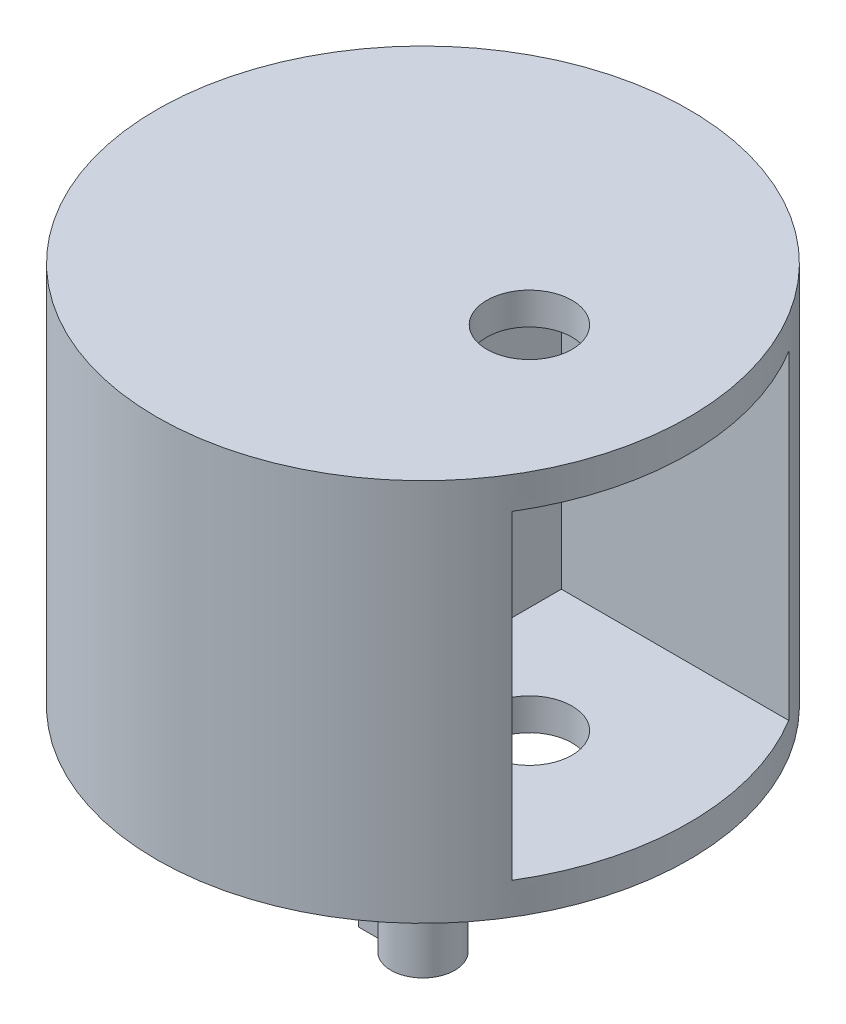
ISO-10303-21;
HEADER;
FILE_DESCRIPTION(('STEP AP214'),'2;1');
FILE_NAME('part.step','',(''),(''),'','','');
FILE_SCHEMA(('AUTOMOTIVE_DESIGN { 1 0 10303 214 1 1 1 1 }'));
ENDSEC;
DATA;
#1=APPLICATION_CONTEXT('core data for automotive mechanical design processes');
#2=APPLICATION_PROTOCOL_DEFINITION('international standard','automotive_design',2000,#1);
#3=PRODUCT_CONTEXT('',#1,'mechanical');
#4=PRODUCT('Part','Part','',(#3));
#5=PRODUCT_RELATED_PRODUCT_CATEGORY('part','',(#4));
#6=PRODUCT_DEFINITION_FORMATION('','',#4);
#7=PRODUCT_DEFINITION_CONTEXT('part definition',#1,'design');
#8=PRODUCT_DEFINITION('design','',#6,#7);
#9=PRODUCT_DEFINITION_SHAPE('','',#8);
#10=(LENGTH_UNIT() NAMED_UNIT(*) SI_UNIT(.MILLI.,.METRE.));
#11=(NAMED_UNIT(*) PLANE_ANGLE_UNIT() SI_UNIT($,.RADIAN.));
#12=(NAMED_UNIT(*) SI_UNIT($,.STERADIAN.) SOLID_ANGLE_UNIT());
#13=UNCERTAINTY_MEASURE_WITH_UNIT(LENGTH_MEASURE(1.E-05),#10,'distance_accuracy_value','');
#14=(GEOMETRIC_REPRESENTATION_CONTEXT(3) GLOBAL_UNCERTAINTY_ASSIGNED_CONTEXT((#13)) GLOBAL_UNIT_ASSIGNED_CONTEXT((#10,
#11,#12)) REPRESENTATION_CONTEXT('',''));
#15=CARTESIAN_POINT('',(0.,0.,0.));
#16=DIRECTION('',(0.,0.,1.));
#17=DIRECTION('',(1.,0.,0.));
#18=AXIS2_PLACEMENT_3D('',#15,#16,#17);
#19=CARTESIAN_POINT('',(0.,0.,0.));
#20=DIRECTION('',(0.,1.,0.));
#21=DIRECTION('',(0.,0.,1.));
#22=AXIS2_PLACEMENT_3D('',#19,#20,#21);
#23=PLANE('',#22);
#24=CARTESIAN_POINT('',(0.,0.,0.));
#25=DIRECTION('',(0.,1.,0.));
#26=DIRECTION('',(0.,0.,1.));
#27=AXIS2_PLACEMENT_3D('',#24,#25,#26);
#28=CIRCLE('',#27,12.5);
#29=CARTESIAN_POINT('',(0.,0.,12.5));
#30=VERTEX_POINT('',#29);
#31=EDGE_CURVE('E179',#30,#30,#28,.T.);
#32=ORIENTED_EDGE('',*,*,#31,.F.);
#33=EDGE_LOOP('',(#32));
#34=FACE_BOUND('',#33,.T.);
#35=CARTESIAN_POINT('',(5.,0.,0.));
#36=DIRECTION('',(0.,-1.,0.));
#37=DIRECTION('',(0.,0.,-1.));
#38=AXIS2_PLACEMENT_3D('',#35,#36,#37);
#39=CIRCLE('',#38,2.);
#40=CARTESIAN_POINT('',(5.,0.,-2.));
#41=VERTEX_POINT('',#40);
#42=EDGE_CURVE('E133',#41,#41,#39,.T.);
#43=ORIENTED_EDGE('',*,*,#42,.F.);
#44=EDGE_LOOP('',(#43));
#45=FACE_BOUND('',#44,.T.);
#46=CARTESIAN_POINT('',(0.,0.,0.));
#47=DIRECTION('',(0.,-1.,0.));
#48=DIRECTION('',(0.,0.,-1.));
#49=AXIS2_PLACEMENT_3D('',#46,#47,#48);
#50=CIRCLE('',#49,1.5);
#51=CARTESIAN_POINT('',(-1.4142135623731,0.,-0.5));
#52=VERTEX_POINT('',#51);
#53=CARTESIAN_POINT('',(-1.4142135623731,0.,0.5));
#54=VERTEX_POINT('',#53);
#55=EDGE_CURVE('E131',#52,#54,#50,.T.);
#56=ORIENTED_EDGE('',*,*,#55,.F.);
#57=DIRECTION('',(1.,0.,0.));
#58=VECTOR('',#57,1.);
#59=CARTESIAN_POINT('',(-1.4142135623731,0.,-0.5));
#60=LINE('',#59,#58);
#61=CARTESIAN_POINT('',(-2.5142135623731,0.,-0.5));
#62=VERTEX_POINT('',#61);
#63=EDGE_CURVE('E128',#62,#52,#60,.T.);
#64=ORIENTED_EDGE('',*,*,#63,.F.);
#65=DIRECTION('',(0.,0.,-1.));
#66=VECTOR('',#65,1.);
#67=CARTESIAN_POINT('',(-2.5142135623731,0.,0.5));
#68=LINE('',#67,#66);
#69=CARTESIAN_POINT('',(-2.5142135623731,0.,0.5));
#70=VERTEX_POINT('',#69);
#71=EDGE_CURVE('E65',#70,#62,#68,.T.);
#72=ORIENTED_EDGE('',*,*,#71,.F.);
#73=DIRECTION('',(-1.,0.,0.));
#74=VECTOR('',#73,1.);
#75=CARTESIAN_POINT('',(-1.4142135623731,0.,0.5));
#76=LINE('',#75,#74);
#77=EDGE_CURVE('E60',#54,#70,#76,.T.);
#78=ORIENTED_EDGE('',*,*,#77,.F.);
#79=EDGE_LOOP('',(#56,#64,#72,#78));
#80=FACE_BOUND('',#79,.T.);
#81=ADVANCED_FACE('F43',(#34,#45,#80),#23,.F.);
#82=CARTESIAN_POINT('',(0.,18.,0.));
#83=DIRECTION('',(0.,-1.,0.));
#84=DIRECTION('',(0.,0.,-1.));
#85=AXIS2_PLACEMENT_3D('',#82,#83,#84);
#86=CYLINDRICAL_SURFACE('',#85,12.5);
#87=ORIENTED_EDGE('',*,*,#31,.T.);
#88=EDGE_LOOP('',(#87));
#89=FACE_BOUND('',#88,.T.);
#90=CARTESIAN_POINT('',(0.,18.,0.));
#91=DIRECTION('',(0.,1.,0.));
#92=DIRECTION('',(0.,0.,1.));
#93=AXIS2_PLACEMENT_3D('',#90,#91,#92);
#94=CIRCLE('',#93,12.5);
#95=CARTESIAN_POINT('',(0.,18.,12.5));
#96=VERTEX_POINT('',#95);
#97=EDGE_CURVE('E180',#96,#96,#94,.T.);
#98=ORIENTED_EDGE('',*,*,#97,.F.);
#99=EDGE_LOOP('',(#98));
#100=FACE_BOUND('',#99,.T.);
#101=DIRECTION('',(0.,-1.,0.));
#102=VECTOR('',#101,1.);
#103=CARTESIAN_POINT('',(10.6770782520313,18.,-6.5));
#104=LINE('',#103,#102);
#105=CARTESIAN_POINT('',(10.6770782520313,1.5,-6.5));
#106=VERTEX_POINT('',#105);
#107=CARTESIAN_POINT('',(10.6770782520313,16.5,-6.5));
#108=VERTEX_POINT('',#107);
#109=EDGE_CURVE('E11',#106,#108,#104,.F.);
#110=ORIENTED_EDGE('',*,*,#109,.F.);
#111=CARTESIAN_POINT('',(0.,1.5,0.));
#112=DIRECTION('',(0.,1.,0.));
#113=DIRECTION('',(0.,0.,1.));
#114=AXIS2_PLACEMENT_3D('',#111,#112,#113);
#115=CIRCLE('',#114,12.5);
#116=CARTESIAN_POINT('',(10.6770782520313,1.5,6.5));
#117=VERTEX_POINT('',#116);
#118=EDGE_CURVE('E184',#117,#106,#115,.T.);
#119=ORIENTED_EDGE('',*,*,#118,.F.);
#120=DIRECTION('',(0.,-1.,0.));
#121=VECTOR('',#120,1.);
#122=CARTESIAN_POINT('',(10.6770782520313,18.,6.5));
#123=LINE('',#122,#121);
#124=CARTESIAN_POINT('',(10.6770782520313,16.5,6.5));
#125=VERTEX_POINT('',#124);
#126=EDGE_CURVE('E190',#125,#117,#123,.T.);
#127=ORIENTED_EDGE('',*,*,#126,.F.);
#128=CARTESIAN_POINT('',(0.,16.5,0.));
#129=DIRECTION('',(0.,-1.,0.));
#130=DIRECTION('',(0.,0.,-1.));
#131=AXIS2_PLACEMENT_3D('',#128,#129,#130);
#132=CIRCLE('',#131,12.5);
#133=EDGE_CURVE('E53',#108,#125,#132,.T.);
#134=ORIENTED_EDGE('',*,*,#133,.F.);
#135=EDGE_LOOP('',(#110,#119,#127,#134));
#136=FACE_BOUND('',#135,.T.);
#137=ADVANCED_FACE('F45',(#89,#100,#136),#86,.T.);
#138=CARTESIAN_POINT('',(0.,18.,0.));
#139=DIRECTION('',(0.,1.,0.));
#140=DIRECTION('',(0.,0.,1.));
#141=AXIS2_PLACEMENT_3D('',#138,#139,#140);
#142=PLANE('',#141);
#143=CARTESIAN_POINT('',(5.,18.,0.));
#144=DIRECTION('',(0.,-1.,0.));
#145=DIRECTION('',(0.,0.,-1.));
#146=AXIS2_PLACEMENT_3D('',#143,#144,#145);
#147=CIRCLE('',#146,2.);
#148=CARTESIAN_POINT('',(5.,18.,-2.));
#149=VERTEX_POINT('',#148);
#150=EDGE_CURVE('E138',#149,#149,#147,.T.);
#151=ORIENTED_EDGE('',*,*,#150,.T.);
#152=EDGE_LOOP('',(#151));
#153=FACE_BOUND('',#152,.T.);
#154=ORIENTED_EDGE('',*,*,#97,.T.);
#155=EDGE_LOOP('',(#154));
#156=FACE_BOUND('',#155,.T.);
#157=ADVANCED_FACE('F236',(#153,#156),#142,.T.);
#158=CARTESIAN_POINT('',(18.,16.5,-6.5));
#159=DIRECTION('',(0.,0.,1.));
#160=DIRECTION('',(0.,-1.,0.));
#161=AXIS2_PLACEMENT_3D('',#158,#159,#160);
#162=PLANE('',#161);
#163=ORIENTED_EDGE('',*,*,#109,.T.);
#164=DIRECTION('',(-1.,0.,0.));
#165=VECTOR('',#164,1.);
#166=CARTESIAN_POINT('',(18.,16.5,-6.5));
#167=LINE('',#166,#165);
#168=CARTESIAN_POINT('',(0.,16.5,-6.5));
#169=VERTEX_POINT('',#168);
#170=EDGE_CURVE('E176',#108,#169,#167,.T.);
#171=ORIENTED_EDGE('',*,*,#170,.T.);
#172=DIRECTION('',(0.,1.,0.));
#173=VECTOR('',#172,1.);
#174=CARTESIAN_POINT('',(0.,16.5,-6.5));
#175=LINE('',#174,#173);
#176=CARTESIAN_POINT('',(0.,1.5,-6.5));
#177=VERTEX_POINT('',#176);
#178=EDGE_CURVE('E151',#177,#169,#175,.T.);
#179=ORIENTED_EDGE('',*,*,#178,.F.);
#180=DIRECTION('',(-1.,0.,0.));
#181=VECTOR('',#180,1.);
#182=CARTESIAN_POINT('',(18.,1.5,-6.5));
#183=LINE('',#182,#181);
#184=EDGE_CURVE('E167',#106,#177,#183,.T.);
#185=ORIENTED_EDGE('',*,*,#184,.F.);
#186=EDGE_LOOP('',(#163,#171,#179,#185));
#187=FACE_BOUND('',#186,.T.);
#188=ADVANCED_FACE('F214',(#187),#162,.T.);
#189=CARTESIAN_POINT('',(18.,16.5,6.5));
#190=DIRECTION('',(0.,-1.,0.));
#191=DIRECTION('',(0.,0.,-1.));
#192=AXIS2_PLACEMENT_3D('',#189,#190,#191);
#193=PLANE('',#192);
#194=CARTESIAN_POINT('',(5.,16.5,0.));
#195=DIRECTION('',(0.,-1.,0.));
#196=DIRECTION('',(0.,0.,-1.));
#197=AXIS2_PLACEMENT_3D('',#194,#195,#196);
#198=CIRCLE('',#197,2.);
#199=CARTESIAN_POINT('',(5.,16.5,-2.));
#200=VERTEX_POINT('',#199);
#201=EDGE_CURVE('E147',#200,#200,#198,.T.);
#202=ORIENTED_EDGE('',*,*,#201,.F.);
#203=EDGE_LOOP('',(#202));
#204=FACE_BOUND('',#203,.T.);
#205=ORIENTED_EDGE('',*,*,#133,.T.);
#206=DIRECTION('',(-1.,0.,0.));
#207=VECTOR('',#206,1.);
#208=CARTESIAN_POINT('',(18.,16.5,6.5));
#209=LINE('',#208,#207);
#210=CARTESIAN_POINT('',(0.,16.5,6.5));
#211=VERTEX_POINT('',#210);
#212=EDGE_CURVE('E173',#125,#211,#209,.T.);
#213=ORIENTED_EDGE('',*,*,#212,.T.);
#214=DIRECTION('',(0.,0.,1.));
#215=VECTOR('',#214,1.);
#216=CARTESIAN_POINT('',(0.,16.5,6.5));
#217=LINE('',#216,#215);
#218=EDGE_CURVE('E155',#169,#211,#217,.T.);
#219=ORIENTED_EDGE('',*,*,#218,.F.);
#220=ORIENTED_EDGE('',*,*,#170,.F.);
#221=EDGE_LOOP('',(#205,#213,#219,#220));
#222=FACE_BOUND('',#221,.T.);
#223=ADVANCED_FACE('F199',(#204,#222),#193,.T.);
#224=CARTESIAN_POINT('',(18.,16.5,6.5));
#225=DIRECTION('',(0.,0.,-1.));
#226=DIRECTION('',(0.,1.,0.));
#227=AXIS2_PLACEMENT_3D('',#224,#225,#226);
#228=PLANE('',#227);
#229=ORIENTED_EDGE('',*,*,#126,.T.);
#230=DIRECTION('',(-1.,0.,0.));
#231=VECTOR('',#230,1.);
#232=CARTESIAN_POINT('',(18.,1.5,6.5));
#233=LINE('',#232,#231);
#234=CARTESIAN_POINT('',(0.,1.5,6.5));
#235=VERTEX_POINT('',#234);
#236=EDGE_CURVE('E170',#117,#235,#233,.T.);
#237=ORIENTED_EDGE('',*,*,#236,.T.);
#238=DIRECTION('',(0.,-1.,0.));
#239=VECTOR('',#238,1.);
#240=CARTESIAN_POINT('',(0.,16.5,6.5));
#241=LINE('',#240,#239);
#242=EDGE_CURVE('E159',#211,#235,#241,.T.);
#243=ORIENTED_EDGE('',*,*,#242,.F.);
#244=ORIENTED_EDGE('',*,*,#212,.F.);
#245=EDGE_LOOP('',(#229,#237,#243,#244));
#246=FACE_BOUND('',#245,.T.);
#247=ADVANCED_FACE('F206',(#246),#228,.T.);
#248=CARTESIAN_POINT('',(18.,1.5,6.5));
#249=DIRECTION('',(0.,1.,0.));
#250=DIRECTION('',(0.,0.,1.));
#251=AXIS2_PLACEMENT_3D('',#248,#249,#250);
#252=PLANE('',#251);
#253=CARTESIAN_POINT('',(5.,1.5,0.));
#254=DIRECTION('',(0.,1.,0.));
#255=DIRECTION('',(0.,0.,1.));
#256=AXIS2_PLACEMENT_3D('',#253,#254,#255);
#257=CIRCLE('',#256,2.);
#258=CARTESIAN_POINT('',(5.,1.5,2.));
#259=VERTEX_POINT('',#258);
#260=EDGE_CURVE('E47',#259,#259,#257,.T.);
#261=ORIENTED_EDGE('',*,*,#260,.F.);
#262=EDGE_LOOP('',(#261));
#263=FACE_BOUND('',#262,.T.);
#264=ORIENTED_EDGE('',*,*,#118,.T.);
#265=ORIENTED_EDGE('',*,*,#184,.T.);
#266=DIRECTION('',(0.,0.,-1.));
#267=VECTOR('',#266,1.);
#268=CARTESIAN_POINT('',(0.,1.5,6.5));
#269=LINE('',#268,#267);
#270=EDGE_CURVE('E163',#235,#177,#269,.T.);
#271=ORIENTED_EDGE('',*,*,#270,.F.);
#272=ORIENTED_EDGE('',*,*,#236,.F.);
#273=EDGE_LOOP('',(#264,#265,#271,#272));
#274=FACE_BOUND('',#273,.T.);
#275=ADVANCED_FACE('F210',(#263,#274),#252,.T.);
#276=CARTESIAN_POINT('',(0.,0.,0.));
#277=DIRECTION('',(1.,0.,0.));
#278=DIRECTION('',(0.,0.,-1.));
#279=AXIS2_PLACEMENT_3D('',#276,#277,#278);
#280=PLANE('',#279);
#281=ORIENTED_EDGE('',*,*,#178,.T.);
#282=ORIENTED_EDGE('',*,*,#218,.T.);
#283=ORIENTED_EDGE('',*,*,#242,.T.);
#284=ORIENTED_EDGE('',*,*,#270,.T.);
#285=EDGE_LOOP('',(#281,#282,#283,#284));
#286=FACE_BOUND('',#285,.T.);
#287=ADVANCED_FACE('F216',(#286),#280,.T.);
#288=CARTESIAN_POINT('',(5.,18.,0.));
#289=DIRECTION('',(0.,-1.,0.));
#290=DIRECTION('',(0.,0.,-1.));
#291=AXIS2_PLACEMENT_3D('',#288,#289,#290);
#292=CYLINDRICAL_SURFACE('',#291,2.);
#293=ORIENTED_EDGE('',*,*,#260,.T.);
#294=EDGE_LOOP('',(#293));
#295=FACE_BOUND('',#294,.T.);
#296=ORIENTED_EDGE('',*,*,#42,.T.);
#297=EDGE_LOOP('',(#296));
#298=FACE_BOUND('',#297,.T.);
#299=ADVANCED_FACE('F218',(#295,#298),#292,.F.);
#300=ORIENTED_EDGE('',*,*,#201,.T.);
#301=EDGE_LOOP('',(#300));
#302=FACE_BOUND('',#301,.T.);
#303=ORIENTED_EDGE('',*,*,#150,.F.);
#304=EDGE_LOOP('',(#303));
#305=FACE_BOUND('',#304,.T.);
#306=ADVANCED_FACE('F224',(#302,#305),#292,.F.);
#307=CARTESIAN_POINT('',(0.,-10.,0.));
#308=DIRECTION('',(0.,1.,0.));
#309=DIRECTION('',(0.,0.,1.));
#310=AXIS2_PLACEMENT_3D('',#307,#308,#309);
#311=CYLINDRICAL_SURFACE('',#310,1.5);
#312=ORIENTED_EDGE('',*,*,#55,.T.);
#313=DIRECTION('',(0.,1.,0.));
#314=VECTOR('',#313,1.);
#315=CARTESIAN_POINT('',(-1.4142135623731,-10.,0.5));
#316=LINE('',#315,#314);
#317=CARTESIAN_POINT('',(-1.4142135623731,-10.,0.5));
#318=VERTEX_POINT('',#317);
#319=EDGE_CURVE('E110',#318,#54,#316,.T.);
#320=ORIENTED_EDGE('',*,*,#319,.F.);
#321=CARTESIAN_POINT('',(0.,-10.,0.));
#322=DIRECTION('',(0.,-1.,0.));
#323=DIRECTION('',(0.,0.,-1.));
#324=AXIS2_PLACEMENT_3D('',#321,#322,#323);
#325=CIRCLE('',#324,1.5);
#326=CARTESIAN_POINT('',(-1.4142135623731,-10.,-0.5));
#327=VERTEX_POINT('',#326);
#328=EDGE_CURVE('E118',#327,#318,#325,.T.);
#329=ORIENTED_EDGE('',*,*,#328,.F.);
#330=DIRECTION('',(0.,1.,0.));
#331=VECTOR('',#330,1.);
#332=CARTESIAN_POINT('',(-1.4142135623731,-10.,-0.5));
#333=LINE('',#332,#331);
#334=EDGE_CURVE('E382',#327,#52,#333,.T.);
#335=ORIENTED_EDGE('',*,*,#334,.T.);
#336=EDGE_LOOP('',(#312,#320,#329,#335));
#337=FACE_BOUND('',#336,.T.);
#338=ADVANCED_FACE('F130',(#337),#311,.T.);
#339=CARTESIAN_POINT('',(-1.4142135623731,-10.,0.5));
#340=DIRECTION('',(0.,0.,-1.));
#341=DIRECTION('',(-1.,0.,0.));
#342=AXIS2_PLACEMENT_3D('',#339,#340,#341);
#343=PLANE('',#342);
#344=ORIENTED_EDGE('',*,*,#77,.T.);
#345=DIRECTION('',(0.,1.,0.));
#346=VECTOR('',#345,1.);
#347=CARTESIAN_POINT('',(-2.5142135623731,-10.,0.5));
#348=LINE('',#347,#346);
#349=CARTESIAN_POINT('',(-2.5142135623731,-10.,0.5));
#350=VERTEX_POINT('',#349);
#351=EDGE_CURVE('E113',#350,#70,#348,.T.);
#352=ORIENTED_EDGE('',*,*,#351,.F.);
#353=DIRECTION('',(-1.,0.,0.));
#354=VECTOR('',#353,1.);
#355=CARTESIAN_POINT('',(-1.4142135623731,-10.,0.5));
#356=LINE('',#355,#354);
#357=EDGE_CURVE('E106',#318,#350,#356,.T.);
#358=ORIENTED_EDGE('',*,*,#357,.F.);
#359=ORIENTED_EDGE('',*,*,#319,.T.);
#360=EDGE_LOOP('',(#344,#352,#358,#359));
#361=FACE_BOUND('',#360,.T.);
#362=ADVANCED_FACE('F108',(#361),#343,.F.);
#363=CARTESIAN_POINT('',(-2.5142135623731,-10.,0.5));
#364=DIRECTION('',(1.,0.,0.));
#365=DIRECTION('',(0.,0.,-1.));
#366=AXIS2_PLACEMENT_3D('',#363,#364,#365);
#367=PLANE('',#366);
#368=ORIENTED_EDGE('',*,*,#71,.T.);
#369=DIRECTION('',(0.,1.,0.));
#370=VECTOR('',#369,1.);
#371=CARTESIAN_POINT('',(-2.5142135623731,-10.,-0.5));
#372=LINE('',#371,#370);
#373=CARTESIAN_POINT('',(-2.5142135623731,-10.,-0.5));
#374=VERTEX_POINT('',#373);
#375=EDGE_CURVE('E140',#374,#62,#372,.T.);
#376=ORIENTED_EDGE('',*,*,#375,.F.);
#377=DIRECTION('',(0.,0.,-1.));
#378=VECTOR('',#377,1.);
#379=CARTESIAN_POINT('',(-2.5142135623731,-10.,0.5));
#380=LINE('',#379,#378);
#381=EDGE_CURVE('E117',#350,#374,#380,.T.);
#382=ORIENTED_EDGE('',*,*,#381,.F.);
#383=ORIENTED_EDGE('',*,*,#351,.T.);
#384=EDGE_LOOP('',(#368,#376,#382,#383));
#385=FACE_BOUND('',#384,.T.);
#386=ADVANCED_FACE('F297',(#385),#367,.F.);
#387=CARTESIAN_POINT('',(-1.4142135623731,-10.,-0.5));
#388=DIRECTION('',(0.,0.,1.));
#389=DIRECTION('',(1.,0.,0.));
#390=AXIS2_PLACEMENT_3D('',#387,#388,#389);
#391=PLANE('',#390);
#392=ORIENTED_EDGE('',*,*,#63,.T.);
#393=ORIENTED_EDGE('',*,*,#334,.F.);
#394=DIRECTION('',(1.,0.,0.));
#395=VECTOR('',#394,1.);
#396=CARTESIAN_POINT('',(-1.4142135623731,-10.,-0.5));
#397=LINE('',#396,#395);
#398=EDGE_CURVE('E123',#374,#327,#397,.T.);
#399=ORIENTED_EDGE('',*,*,#398,.F.);
#400=ORIENTED_EDGE('',*,*,#375,.T.);
#401=EDGE_LOOP('',(#392,#393,#399,#400));
#402=FACE_BOUND('',#401,.T.);
#403=ADVANCED_FACE('F304',(#402),#391,.F.);
#404=CARTESIAN_POINT('',(0.,-10.,0.));
#405=DIRECTION('',(0.,-1.,0.));
#406=DIRECTION('',(0.,0.,-1.));
#407=AXIS2_PLACEMENT_3D('',#404,#405,#406);
#408=PLANE('',#407);
#409=ORIENTED_EDGE('',*,*,#328,.T.);
#410=ORIENTED_EDGE('',*,*,#357,.T.);
#411=ORIENTED_EDGE('',*,*,#381,.T.);
#412=ORIENTED_EDGE('',*,*,#398,.T.);
#413=EDGE_LOOP('',(#409,#410,#411,#412));
#414=FACE_BOUND('',#413,.T.);
#415=ADVANCED_FACE('F121',(#414),#408,.T.);
#416=CLOSED_SHELL('',(#81,#137,#157,#188,#223,#247,#275,#287,#299,#306,#338,#362,#386,#403,#415));
#417=MANIFOLD_SOLID_BREP('B2',#416);
#418=ADVANCED_BREP_SHAPE_REPRESENTATION('',(#18,#417),#14);
#419=SHAPE_DEFINITION_REPRESENTATION(#9,#418);
ENDSEC;
END-ISO-10303-21;
